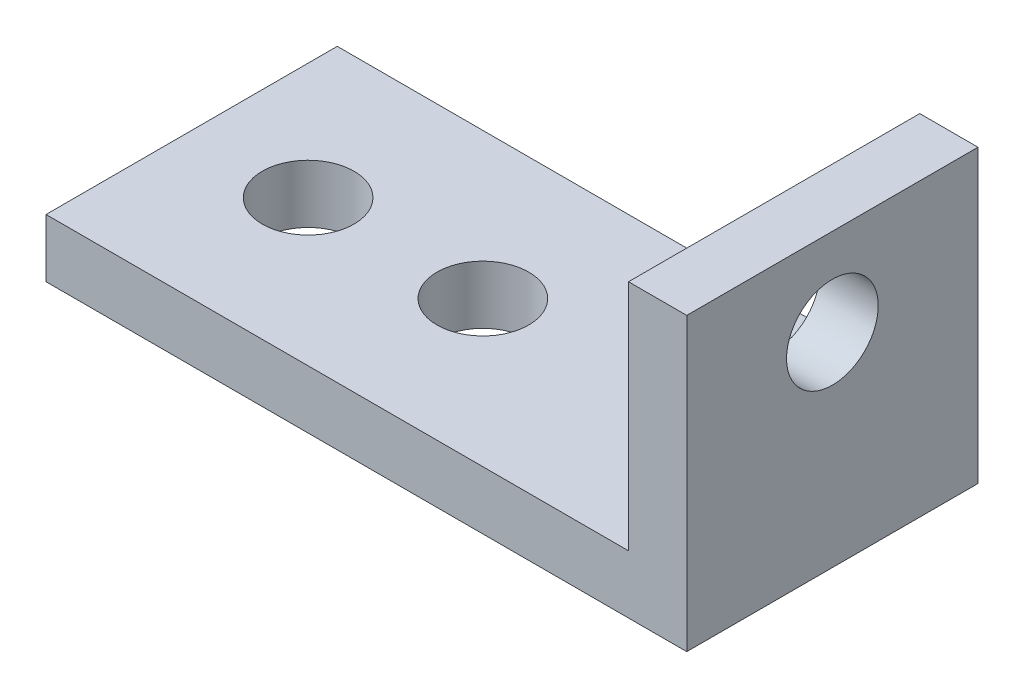
ISO-10303-21;
HEADER;
FILE_DESCRIPTION(('STEP AP214'),'2;1');
FILE_NAME('part.step','',(''),(''),'','','');
FILE_SCHEMA(('AUTOMOTIVE_DESIGN { 1 0 10303 214 1 1 1 1 }'));
ENDSEC;
DATA;
#1=APPLICATION_CONTEXT('core data for automotive mechanical design processes');
#2=APPLICATION_PROTOCOL_DEFINITION('international standard','automotive_design',2000,#1);
#3=PRODUCT_CONTEXT('',#1,'mechanical');
#4=PRODUCT('Part','Part','',(#3));
#5=PRODUCT_RELATED_PRODUCT_CATEGORY('part','',(#4));
#6=PRODUCT_DEFINITION_FORMATION('','',#4);
#7=PRODUCT_DEFINITION_CONTEXT('part definition',#1,'design');
#8=PRODUCT_DEFINITION('design','',#6,#7);
#9=PRODUCT_DEFINITION_SHAPE('','',#8);
#10=(LENGTH_UNIT() NAMED_UNIT(*) SI_UNIT(.MILLI.,.METRE.));
#11=(NAMED_UNIT(*) PLANE_ANGLE_UNIT() SI_UNIT($,.RADIAN.));
#12=(NAMED_UNIT(*) SI_UNIT($,.STERADIAN.) SOLID_ANGLE_UNIT());
#13=UNCERTAINTY_MEASURE_WITH_UNIT(LENGTH_MEASURE(1.E-05),#10,'distance_accuracy_value','');
#14=(GEOMETRIC_REPRESENTATION_CONTEXT(3) GLOBAL_UNCERTAINTY_ASSIGNED_CONTEXT((#13)) GLOBAL_UNIT_ASSIGNED_CONTEXT((#10,
#11,#12)) REPRESENTATION_CONTEXT('',''));
#15=CARTESIAN_POINT('',(0.,0.,0.));
#16=DIRECTION('',(0.,0.,1.));
#17=DIRECTION('',(1.,0.,0.));
#18=AXIS2_PLACEMENT_3D('',#15,#16,#17);
#19=CARTESIAN_POINT('',(27.94,0.,12.7));
#20=DIRECTION('',(0.,1.,0.));
#21=DIRECTION('',(0.,0.,1.));
#22=AXIS2_PLACEMENT_3D('',#19,#20,#21);
#23=PLANE('',#22);
#24=CARTESIAN_POINT('',(5.08,0.,6.35));
#25=DIRECTION('',(0.,1.,0.));
#26=DIRECTION('',(0.,0.,1.));
#27=AXIS2_PLACEMENT_3D('',#24,#25,#26);
#28=CIRCLE('',#27,2.);
#29=CARTESIAN_POINT('',(5.08,0.,8.35));
#30=VERTEX_POINT('',#29);
#31=EDGE_CURVE('E127',#30,#30,#28,.T.);
#32=ORIENTED_EDGE('',*,*,#31,.T.);
#33=EDGE_LOOP('',(#32));
#34=FACE_BOUND('',#33,.T.);
#35=CARTESIAN_POINT('',(12.7,0.,6.35));
#36=DIRECTION('',(0.,1.,0.));
#37=DIRECTION('',(0.,0.,1.));
#38=AXIS2_PLACEMENT_3D('',#35,#36,#37);
#39=CIRCLE('',#38,2.);
#40=CARTESIAN_POINT('',(12.7,0.,8.35));
#41=VERTEX_POINT('',#40);
#42=EDGE_CURVE('E172',#41,#41,#39,.T.);
#43=ORIENTED_EDGE('',*,*,#42,.T.);
#44=EDGE_LOOP('',(#43));
#45=FACE_BOUND('',#44,.T.);
#46=DIRECTION('',(1.,0.,0.));
#47=VECTOR('',#46,1.);
#48=CARTESIAN_POINT('',(27.94,0.,0.));
#49=LINE('',#48,#47);
#50=CARTESIAN_POINT('',(0.,0.,0.));
#51=VERTEX_POINT('',#50);
#52=CARTESIAN_POINT('',(27.94,0.,0.));
#53=VERTEX_POINT('',#52);
#54=EDGE_CURVE('E123',#51,#53,#49,.T.);
#55=ORIENTED_EDGE('',*,*,#54,.T.);
#56=DIRECTION('',(0.,0.,-1.));
#57=VECTOR('',#56,1.);
#58=CARTESIAN_POINT('',(27.94,0.,12.7));
#59=LINE('',#58,#57);
#60=CARTESIAN_POINT('',(27.94,0.,12.7));
#61=VERTEX_POINT('',#60);
#62=EDGE_CURVE('E11',#61,#53,#59,.T.);
#63=ORIENTED_EDGE('',*,*,#62,.F.);
#64=DIRECTION('',(1.,0.,0.));
#65=VECTOR('',#64,1.);
#66=CARTESIAN_POINT('',(27.94,0.,12.7));
#67=LINE('',#66,#65);
#68=CARTESIAN_POINT('',(0.,0.,12.7));
#69=VERTEX_POINT('',#68);
#70=EDGE_CURVE('E134',#69,#61,#67,.T.);
#71=ORIENTED_EDGE('',*,*,#70,.F.);
#72=DIRECTION('',(0.,0.,-1.));
#73=VECTOR('',#72,1.);
#74=CARTESIAN_POINT('',(0.,0.,12.7));
#75=LINE('',#74,#73);
#76=EDGE_CURVE('E119',#69,#51,#75,.T.);
#77=ORIENTED_EDGE('',*,*,#76,.T.);
#78=EDGE_LOOP('',(#55,#63,#71,#77));
#79=FACE_BOUND('',#78,.T.);
#80=ADVANCED_FACE('F39',(#34,#45,#79),#23,.F.);
#81=CARTESIAN_POINT('',(27.94,12.7,12.7));
#82=DIRECTION('',(-1.,0.,0.));
#83=DIRECTION('',(0.,-1.,0.));
#84=AXIS2_PLACEMENT_3D('',#81,#82,#83);
#85=PLANE('',#84);
#86=CARTESIAN_POINT('',(27.94,8.89,6.35));
#87=DIRECTION('',(-1.,0.,0.));
#88=DIRECTION('',(0.,0.,1.));
#89=AXIS2_PLACEMENT_3D('',#86,#87,#88);
#90=CIRCLE('',#89,2.);
#91=CARTESIAN_POINT('',(27.94,8.89,8.35));
#92=VERTEX_POINT('',#91);
#93=EDGE_CURVE('E175',#92,#92,#90,.T.);
#94=ORIENTED_EDGE('',*,*,#93,.T.);
#95=EDGE_LOOP('',(#94));
#96=FACE_BOUND('',#95,.T.);
#97=DIRECTION('',(0.,1.,0.));
#98=VECTOR('',#97,1.);
#99=CARTESIAN_POINT('',(27.94,12.7,0.));
#100=LINE('',#99,#98);
#101=CARTESIAN_POINT('',(27.94,12.7,0.));
#102=VERTEX_POINT('',#101);
#103=EDGE_CURVE('E126',#53,#102,#100,.T.);
#104=ORIENTED_EDGE('',*,*,#103,.T.);
#105=DIRECTION('',(0.,0.,-1.));
#106=VECTOR('',#105,1.);
#107=CARTESIAN_POINT('',(27.94,12.7,12.7));
#108=LINE('',#107,#106);
#109=CARTESIAN_POINT('',(27.94,12.7,12.7));
#110=VERTEX_POINT('',#109);
#111=EDGE_CURVE('E47',#110,#102,#108,.T.);
#112=ORIENTED_EDGE('',*,*,#111,.F.);
#113=DIRECTION('',(0.,1.,0.));
#114=VECTOR('',#113,1.);
#115=CARTESIAN_POINT('',(27.94,12.7,12.7));
#116=LINE('',#115,#114);
#117=EDGE_CURVE('E92',#61,#110,#116,.T.);
#118=ORIENTED_EDGE('',*,*,#117,.F.);
#119=ORIENTED_EDGE('',*,*,#62,.T.);
#120=EDGE_LOOP('',(#104,#112,#118,#119));
#121=FACE_BOUND('',#120,.T.);
#122=ADVANCED_FACE('F160',(#96,#121),#85,.F.);
#123=CARTESIAN_POINT('',(25.4,12.7,12.7));
#124=DIRECTION('',(0.,-1.,0.));
#125=DIRECTION('',(0.,0.,-1.));
#126=AXIS2_PLACEMENT_3D('',#123,#124,#125);
#127=PLANE('',#126);
#128=DIRECTION('',(-1.,0.,0.));
#129=VECTOR('',#128,1.);
#130=CARTESIAN_POINT('',(25.4,12.7,0.));
#131=LINE('',#130,#129);
#132=CARTESIAN_POINT('',(25.4,12.7,0.));
#133=VERTEX_POINT('',#132);
#134=EDGE_CURVE('E129',#102,#133,#131,.T.);
#135=ORIENTED_EDGE('',*,*,#134,.T.);
#136=DIRECTION('',(0.,0.,-1.));
#137=VECTOR('',#136,1.);
#138=CARTESIAN_POINT('',(25.4,12.7,12.7));
#139=LINE('',#138,#137);
#140=CARTESIAN_POINT('',(25.4,12.7,12.7));
#141=VERTEX_POINT('',#140);
#142=EDGE_CURVE('E114',#141,#133,#139,.T.);
#143=ORIENTED_EDGE('',*,*,#142,.F.);
#144=DIRECTION('',(-1.,0.,0.));
#145=VECTOR('',#144,1.);
#146=CARTESIAN_POINT('',(25.4,12.7,12.7));
#147=LINE('',#146,#145);
#148=EDGE_CURVE('E105',#110,#141,#147,.T.);
#149=ORIENTED_EDGE('',*,*,#148,.F.);
#150=ORIENTED_EDGE('',*,*,#111,.T.);
#151=EDGE_LOOP('',(#135,#143,#149,#150));
#152=FACE_BOUND('',#151,.T.);
#153=ADVANCED_FACE('F140',(#152),#127,.F.);
#154=CARTESIAN_POINT('',(25.4,2.54,12.7));
#155=DIRECTION('',(1.,0.,0.));
#156=DIRECTION('',(0.,0.,-1.));
#157=AXIS2_PLACEMENT_3D('',#154,#155,#156);
#158=PLANE('',#157);
#159=CARTESIAN_POINT('',(25.4,8.89,6.35));
#160=DIRECTION('',(-1.,0.,0.));
#161=DIRECTION('',(0.,0.,1.));
#162=AXIS2_PLACEMENT_3D('',#159,#160,#161);
#163=CIRCLE('',#162,2.);
#164=CARTESIAN_POINT('',(25.4,8.89,8.35));
#165=VERTEX_POINT('',#164);
#166=EDGE_CURVE('E181',#165,#165,#163,.T.);
#167=ORIENTED_EDGE('',*,*,#166,.F.);
#168=EDGE_LOOP('',(#167));
#169=FACE_BOUND('',#168,.T.);
#170=DIRECTION('',(0.,-1.,0.));
#171=VECTOR('',#170,1.);
#172=CARTESIAN_POINT('',(25.4,2.54,0.));
#173=LINE('',#172,#171);
#174=CARTESIAN_POINT('',(25.4,2.54,0.));
#175=VERTEX_POINT('',#174);
#176=EDGE_CURVE('E113',#133,#175,#173,.T.);
#177=ORIENTED_EDGE('',*,*,#176,.T.);
#178=DIRECTION('',(0.,0.,-1.));
#179=VECTOR('',#178,1.);
#180=CARTESIAN_POINT('',(25.4,2.54,12.7));
#181=LINE('',#180,#179);
#182=CARTESIAN_POINT('',(25.4,2.54,12.7));
#183=VERTEX_POINT('',#182);
#184=EDGE_CURVE('E110',#183,#175,#181,.T.);
#185=ORIENTED_EDGE('',*,*,#184,.F.);
#186=DIRECTION('',(0.,-1.,0.));
#187=VECTOR('',#186,1.);
#188=CARTESIAN_POINT('',(25.4,2.54,12.7));
#189=LINE('',#188,#187);
#190=EDGE_CURVE('E99',#141,#183,#189,.T.);
#191=ORIENTED_EDGE('',*,*,#190,.F.);
#192=ORIENTED_EDGE('',*,*,#142,.T.);
#193=EDGE_LOOP('',(#177,#185,#191,#192));
#194=FACE_BOUND('',#193,.T.);
#195=ADVANCED_FACE('F111',(#169,#194),#158,.F.);
#196=CARTESIAN_POINT('',(0.,2.54,12.7));
#197=DIRECTION('',(0.,-1.,0.));
#198=DIRECTION('',(0.,0.,-1.));
#199=AXIS2_PLACEMENT_3D('',#196,#197,#198);
#200=PLANE('',#199);
#201=CARTESIAN_POINT('',(5.08,2.54,6.35));
#202=DIRECTION('',(0.,1.,0.));
#203=DIRECTION('',(0.,0.,1.));
#204=AXIS2_PLACEMENT_3D('',#201,#202,#203);
#205=CIRCLE('',#204,2.);
#206=CARTESIAN_POINT('',(5.08,2.54,8.35));
#207=VERTEX_POINT('',#206);
#208=EDGE_CURVE('E178',#207,#207,#205,.T.);
#209=ORIENTED_EDGE('',*,*,#208,.F.);
#210=EDGE_LOOP('',(#209));
#211=FACE_BOUND('',#210,.T.);
#212=CARTESIAN_POINT('',(12.7,2.54,6.35));
#213=DIRECTION('',(0.,1.,0.));
#214=DIRECTION('',(0.,0.,1.));
#215=AXIS2_PLACEMENT_3D('',#212,#213,#214);
#216=CIRCLE('',#215,2.);
#217=CARTESIAN_POINT('',(12.7,2.54,8.35));
#218=VERTEX_POINT('',#217);
#219=EDGE_CURVE('E174',#218,#218,#216,.T.);
#220=ORIENTED_EDGE('',*,*,#219,.F.);
#221=EDGE_LOOP('',(#220));
#222=FACE_BOUND('',#221,.T.);
#223=DIRECTION('',(-1.,0.,0.));
#224=VECTOR('',#223,1.);
#225=CARTESIAN_POINT('',(0.,2.54,0.));
#226=LINE('',#225,#224);
#227=CARTESIAN_POINT('',(0.,2.54,0.));
#228=VERTEX_POINT('',#227);
#229=EDGE_CURVE('E78',#175,#228,#226,.T.);
#230=ORIENTED_EDGE('',*,*,#229,.T.);
#231=DIRECTION('',(0.,0.,-1.));
#232=VECTOR('',#231,1.);
#233=CARTESIAN_POINT('',(0.,2.54,12.7));
#234=LINE('',#233,#232);
#235=CARTESIAN_POINT('',(0.,2.54,12.7));
#236=VERTEX_POINT('',#235);
#237=EDGE_CURVE('E115',#236,#228,#234,.T.);
#238=ORIENTED_EDGE('',*,*,#237,.F.);
#239=DIRECTION('',(-1.,0.,0.));
#240=VECTOR('',#239,1.);
#241=CARTESIAN_POINT('',(0.,2.54,12.7));
#242=LINE('',#241,#240);
#243=EDGE_CURVE('E103',#183,#236,#242,.T.);
#244=ORIENTED_EDGE('',*,*,#243,.F.);
#245=ORIENTED_EDGE('',*,*,#184,.T.);
#246=EDGE_LOOP('',(#230,#238,#244,#245));
#247=FACE_BOUND('',#246,.T.);
#248=ADVANCED_FACE('F117',(#211,#222,#247),#200,.F.);
#249=CARTESIAN_POINT('',(0.,0.,12.7));
#250=DIRECTION('',(1.,0.,0.));
#251=DIRECTION('',(0.,0.,-1.));
#252=AXIS2_PLACEMENT_3D('',#249,#250,#251);
#253=PLANE('',#252);
#254=DIRECTION('',(0.,-1.,0.));
#255=VECTOR('',#254,1.);
#256=CARTESIAN_POINT('',(0.,0.,0.));
#257=LINE('',#256,#255);
#258=EDGE_CURVE('E84',#228,#51,#257,.T.);
#259=ORIENTED_EDGE('',*,*,#258,.T.);
#260=ORIENTED_EDGE('',*,*,#76,.F.);
#261=DIRECTION('',(0.,-1.,0.));
#262=VECTOR('',#261,1.);
#263=CARTESIAN_POINT('',(0.,0.,12.7));
#264=LINE('',#263,#262);
#265=EDGE_CURVE('E55',#236,#69,#264,.T.);
#266=ORIENTED_EDGE('',*,*,#265,.F.);
#267=ORIENTED_EDGE('',*,*,#237,.T.);
#268=EDGE_LOOP('',(#259,#260,#266,#267));
#269=FACE_BOUND('',#268,.T.);
#270=ADVANCED_FACE('F147',(#269),#253,.F.);
#271=CARTESIAN_POINT('',(0.,0.,12.7));
#272=DIRECTION('',(0.,0.,-1.));
#273=DIRECTION('',(-1.,0.,0.));
#274=AXIS2_PLACEMENT_3D('',#271,#272,#273);
#275=PLANE('',#274);
#276=ORIENTED_EDGE('',*,*,#70,.T.);
#277=ORIENTED_EDGE('',*,*,#117,.T.);
#278=ORIENTED_EDGE('',*,*,#148,.T.);
#279=ORIENTED_EDGE('',*,*,#190,.T.);
#280=ORIENTED_EDGE('',*,*,#243,.T.);
#281=ORIENTED_EDGE('',*,*,#265,.T.);
#282=EDGE_LOOP('',(#276,#277,#278,#279,#280,#281));
#283=FACE_BOUND('',#282,.T.);
#284=ADVANCED_FACE('F101',(#283),#275,.F.);
#285=CARTESIAN_POINT('',(0.,0.,0.));
#286=DIRECTION('',(0.,0.,-1.));
#287=DIRECTION('',(-1.,0.,0.));
#288=AXIS2_PLACEMENT_3D('',#285,#286,#287);
#289=PLANE('',#288);
#290=ORIENTED_EDGE('',*,*,#54,.F.);
#291=ORIENTED_EDGE('',*,*,#258,.F.);
#292=ORIENTED_EDGE('',*,*,#229,.F.);
#293=ORIENTED_EDGE('',*,*,#176,.F.);
#294=ORIENTED_EDGE('',*,*,#134,.F.);
#295=ORIENTED_EDGE('',*,*,#103,.F.);
#296=EDGE_LOOP('',(#290,#291,#292,#293,#294,#295));
#297=FACE_BOUND('',#296,.T.);
#298=ADVANCED_FACE('F143',(#297),#289,.T.);
#299=CARTESIAN_POINT('',(12.7,0.,6.35));
#300=DIRECTION('',(0.,1.,0.));
#301=DIRECTION('',(0.,0.,1.));
#302=AXIS2_PLACEMENT_3D('',#299,#300,#301);
#303=CYLINDRICAL_SURFACE('',#302,2.);
#304=ORIENTED_EDGE('',*,*,#42,.F.);
#305=EDGE_LOOP('',(#304));
#306=FACE_BOUND('',#305,.T.);
#307=ORIENTED_EDGE('',*,*,#219,.T.);
#308=EDGE_LOOP('',(#307));
#309=FACE_BOUND('',#308,.T.);
#310=ADVANCED_FACE('F236',(#306,#309),#303,.F.);
#311=CARTESIAN_POINT('',(5.08,0.,6.35));
#312=DIRECTION('',(0.,1.,0.));
#313=DIRECTION('',(0.,0.,1.));
#314=AXIS2_PLACEMENT_3D('',#311,#312,#313);
#315=CYLINDRICAL_SURFACE('',#314,2.);
#316=ORIENTED_EDGE('',*,*,#31,.F.);
#317=EDGE_LOOP('',(#316));
#318=FACE_BOUND('',#317,.T.);
#319=ORIENTED_EDGE('',*,*,#208,.T.);
#320=EDGE_LOOP('',(#319));
#321=FACE_BOUND('',#320,.T.);
#322=ADVANCED_FACE('F243',(#318,#321),#315,.F.);
#323=CARTESIAN_POINT('',(27.94,8.89,6.35));
#324=DIRECTION('',(-1.,0.,0.));
#325=DIRECTION('',(0.,0.,1.));
#326=AXIS2_PLACEMENT_3D('',#323,#324,#325);
#327=CYLINDRICAL_SURFACE('',#326,2.);
#328=ORIENTED_EDGE('',*,*,#93,.F.);
#329=EDGE_LOOP('',(#328));
#330=FACE_BOUND('',#329,.T.);
#331=ORIENTED_EDGE('',*,*,#166,.T.);
#332=EDGE_LOOP('',(#331));
#333=FACE_BOUND('',#332,.T.);
#334=ADVANCED_FACE('F192',(#330,#333),#327,.F.);
#335=CLOSED_SHELL('',(#80,#122,#153,#195,#248,#270,#284,#298,#310,#322,#334));
#336=MANIFOLD_SOLID_BREP('B2',#335);
#337=ADVANCED_BREP_SHAPE_REPRESENTATION('',(#18,#336),#14);
#338=SHAPE_DEFINITION_REPRESENTATION(#9,#337);
ENDSEC;
END-ISO-10303-21;
